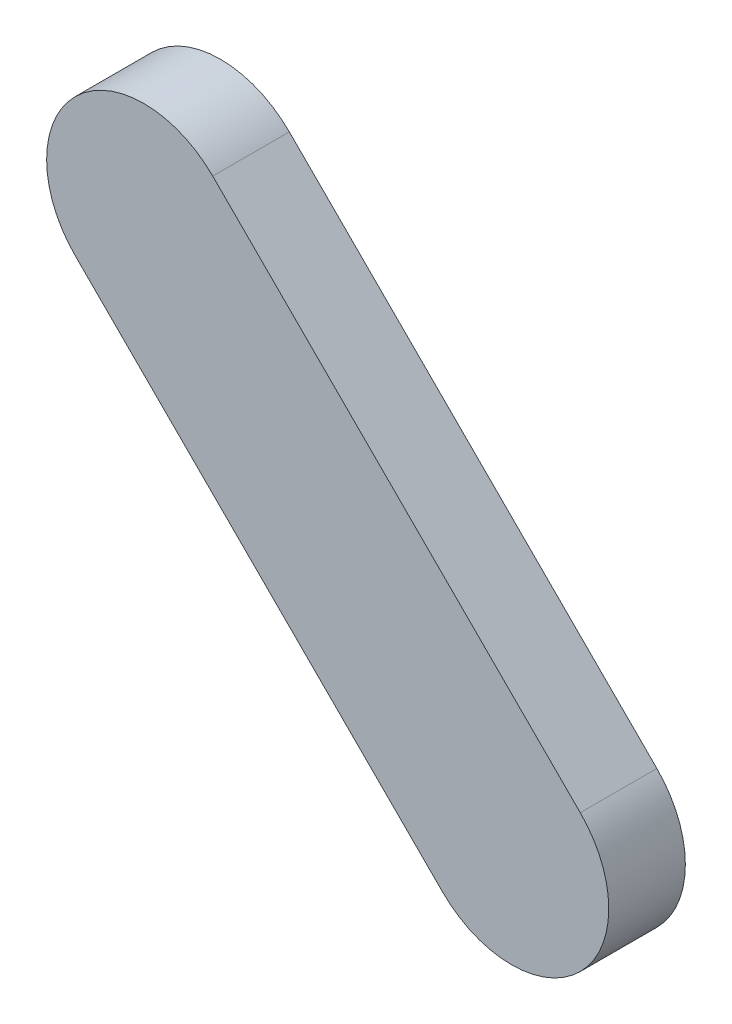
ISO-10303-21;
HEADER;
FILE_DESCRIPTION(('STEP AP214'),'2;1');
FILE_NAME('part.step','',(''),(''),'','','');
FILE_SCHEMA(('AUTOMOTIVE_DESIGN { 1 0 10303 214 1 1 1 1 }'));
ENDSEC;
DATA;
#1=APPLICATION_CONTEXT('core data for automotive mechanical design processes');
#2=APPLICATION_PROTOCOL_DEFINITION('international standard','automotive_design',2000,#1);
#3=PRODUCT_CONTEXT('',#1,'mechanical');
#4=PRODUCT('Part','Part','',(#3));
#5=PRODUCT_RELATED_PRODUCT_CATEGORY('part','',(#4));
#6=PRODUCT_DEFINITION_FORMATION('','',#4);
#7=PRODUCT_DEFINITION_CONTEXT('part definition',#1,'design');
#8=PRODUCT_DEFINITION('design','',#6,#7);
#9=PRODUCT_DEFINITION_SHAPE('','',#8);
#10=(LENGTH_UNIT() NAMED_UNIT(*) SI_UNIT(.MILLI.,.METRE.));
#11=(NAMED_UNIT(*) PLANE_ANGLE_UNIT() SI_UNIT($,.RADIAN.));
#12=(NAMED_UNIT(*) SI_UNIT($,.STERADIAN.) SOLID_ANGLE_UNIT());
#13=UNCERTAINTY_MEASURE_WITH_UNIT(LENGTH_MEASURE(1.E-05),#10,'distance_accuracy_value','');
#14=(GEOMETRIC_REPRESENTATION_CONTEXT(3) GLOBAL_UNCERTAINTY_ASSIGNED_CONTEXT((#13)) GLOBAL_UNIT_ASSIGNED_CONTEXT((#10,
#11,#12)) REPRESENTATION_CONTEXT('',''));
#15=CARTESIAN_POINT('',(0.,0.,0.));
#16=DIRECTION('',(0.,0.,1.));
#17=DIRECTION('',(1.,0.,0.));
#18=AXIS2_PLACEMENT_3D('',#15,#16,#17);
#19=CARTESIAN_POINT('',(149.93439406,76.2235966,0.));
#20=DIRECTION('',(0.707106781186553,0.707106781186542,0.));
#21=DIRECTION('',(0.707106781186542,-0.707106781186553,0.));
#22=AXIS2_PLACEMENT_3D('',#19,#20,#21);
#23=PLANE('',#22);
#24=DIRECTION('',(0.707106781186542,-0.707106781186553,0.));
#25=VECTOR('',#24,1.);
#26=CARTESIAN_POINT('',(149.93439406,76.2235966,0.1999996));
#27=LINE('',#26,#25);
#28=CARTESIAN_POINT('',(149.93439406,76.2235966,0.1999996));
#29=VERTEX_POINT('',#28);
#30=CARTESIAN_POINT('',(150.893907,75.26408366,0.1999996));
#31=VERTEX_POINT('',#30);
#32=EDGE_CURVE('E11',#29,#31,#27,.T.);
#33=ORIENTED_EDGE('',*,*,#32,.F.);
#34=DIRECTION('',(0.,0.,1.));
#35=VECTOR('',#34,1.);
#36=CARTESIAN_POINT('',(149.93439406,76.2235966,0.));
#37=LINE('',#36,#35);
#38=CARTESIAN_POINT('',(149.93439406,76.2235966,0.));
#39=VERTEX_POINT('',#38);
#40=EDGE_CURVE('E24',#39,#29,#37,.T.);
#41=ORIENTED_EDGE('',*,*,#40,.F.);
#42=DIRECTION('',(0.707106781186542,-0.707106781186553,0.));
#43=VECTOR('',#42,1.);
#44=CARTESIAN_POINT('',(149.93439406,76.2235966,0.));
#45=LINE('',#44,#43);
#46=CARTESIAN_POINT('',(150.893907,75.26408366,0.));
#47=VERTEX_POINT('',#46);
#48=EDGE_CURVE('E75',#39,#47,#45,.T.);
#49=ORIENTED_EDGE('',*,*,#48,.T.);
#50=DIRECTION('',(0.,0.,1.));
#51=VECTOR('',#50,1.);
#52=CARTESIAN_POINT('',(150.893907,75.26408366,0.));
#53=LINE('',#52,#51);
#54=EDGE_CURVE('E37',#47,#31,#53,.T.);
#55=ORIENTED_EDGE('',*,*,#54,.T.);
#56=EDGE_LOOP('',(#33,#41,#49,#55));
#57=FACE_BOUND('',#56,.T.);
#58=ADVANCED_FACE('F17',(#57),#23,.F.);
#59=CARTESIAN_POINT('',(151.07351167,75.44368833,0.));
#60=DIRECTION('',(0.,0.,-1.));
#61=DIRECTION('',(-0.707106781186576,-0.70710678118652,0.));
#62=AXIS2_PLACEMENT_3D('',#59,#60,#61);
#63=CYLINDRICAL_SURFACE('',#62,0.253999360179542);
#64=CARTESIAN_POINT('',(151.07351167,75.44368833,0.1999996));
#65=DIRECTION('',(0.,0.,1.));
#66=DIRECTION('',(-0.707106781186576,-0.70710678118652,0.));
#67=AXIS2_PLACEMENT_3D('',#64,#65,#66);
#68=CIRCLE('',#67,0.253999360179542);
#69=CARTESIAN_POINT('',(151.25311634,75.623293,0.1999996));
#70=VERTEX_POINT('',#69);
#71=EDGE_CURVE('E83',#31,#70,#68,.T.);
#72=ORIENTED_EDGE('',*,*,#71,.F.);
#73=ORIENTED_EDGE('',*,*,#54,.F.);
#74=CARTESIAN_POINT('',(151.07351167,75.44368833,0.));
#75=DIRECTION('',(0.,0.,1.));
#76=DIRECTION('',(-0.707106781186576,-0.70710678118652,0.));
#77=AXIS2_PLACEMENT_3D('',#74,#75,#76);
#78=CIRCLE('',#77,0.253999360179542);
#79=CARTESIAN_POINT('',(151.25311634,75.623293,0.));
#80=VERTEX_POINT('',#79);
#81=EDGE_CURVE('E81',#47,#80,#78,.T.);
#82=ORIENTED_EDGE('',*,*,#81,.T.);
#83=DIRECTION('',(0.,0.,1.));
#84=VECTOR('',#83,1.);
#85=CARTESIAN_POINT('',(151.25311634,75.623293,0.));
#86=LINE('',#85,#84);
#87=EDGE_CURVE('E67',#80,#70,#86,.T.);
#88=ORIENTED_EDGE('',*,*,#87,.T.);
#89=EDGE_LOOP('',(#72,#73,#82,#88));
#90=FACE_BOUND('',#89,.T.);
#91=ADVANCED_FACE('F89',(#90),#63,.T.);
#92=CARTESIAN_POINT('',(151.25311634,75.623293,0.));
#93=DIRECTION('',(-0.707106781186548,-0.707106781186548,0.));
#94=DIRECTION('',(-0.707106781186548,0.707106781186548,0.));
#95=AXIS2_PLACEMENT_3D('',#92,#93,#94);
#96=PLANE('',#95);
#97=DIRECTION('',(-0.707106781186548,0.707106781186548,0.));
#98=VECTOR('',#97,1.);
#99=CARTESIAN_POINT('',(151.25311634,75.623293,0.1999996));
#100=LINE('',#99,#98);
#101=CARTESIAN_POINT('',(150.2936034,76.58280594,0.1999996));
#102=VERTEX_POINT('',#101);
#103=EDGE_CURVE('E71',#70,#102,#100,.T.);
#104=ORIENTED_EDGE('',*,*,#103,.F.);
#105=ORIENTED_EDGE('',*,*,#87,.F.);
#106=DIRECTION('',(-0.707106781186548,0.707106781186548,0.));
#107=VECTOR('',#106,1.);
#108=CARTESIAN_POINT('',(151.25311634,75.623293,0.));
#109=LINE('',#108,#107);
#110=CARTESIAN_POINT('',(150.2936034,76.58280594,0.));
#111=VERTEX_POINT('',#110);
#112=EDGE_CURVE('E63',#80,#111,#109,.T.);
#113=ORIENTED_EDGE('',*,*,#112,.T.);
#114=DIRECTION('',(0.,0.,1.));
#115=VECTOR('',#114,1.);
#116=CARTESIAN_POINT('',(150.2936034,76.58280594,0.));
#117=LINE('',#116,#115);
#118=EDGE_CURVE('E53',#111,#102,#117,.T.);
#119=ORIENTED_EDGE('',*,*,#118,.T.);
#120=EDGE_LOOP('',(#104,#105,#113,#119));
#121=FACE_BOUND('',#120,.T.);
#122=ADVANCED_FACE('F66',(#121),#96,.F.);
#123=CARTESIAN_POINT('',(150.11399873,76.40320127,0.));
#124=DIRECTION('',(0.,0.,-1.));
#125=DIRECTION('',(0.707106781186576,0.70710678118652,0.));
#126=AXIS2_PLACEMENT_3D('',#123,#124,#125);
#127=CYLINDRICAL_SURFACE('',#126,0.253999360179539);
#128=CARTESIAN_POINT('',(150.11399873,76.40320127,0.1999996));
#129=DIRECTION('',(0.,0.,1.));
#130=DIRECTION('',(0.707106781186576,0.70710678118652,0.));
#131=AXIS2_PLACEMENT_3D('',#128,#129,#130);
#132=CIRCLE('',#131,0.253999360179539);
#133=EDGE_CURVE('E59',#102,#29,#132,.T.);
#134=ORIENTED_EDGE('',*,*,#133,.F.);
#135=ORIENTED_EDGE('',*,*,#118,.F.);
#136=CARTESIAN_POINT('',(150.11399873,76.40320127,0.));
#137=DIRECTION('',(0.,0.,1.));
#138=DIRECTION('',(0.707106781186576,0.70710678118652,0.));
#139=AXIS2_PLACEMENT_3D('',#136,#137,#138);
#140=CIRCLE('',#139,0.253999360179539);
#141=EDGE_CURVE('E57',#111,#39,#140,.T.);
#142=ORIENTED_EDGE('',*,*,#141,.T.);
#143=ORIENTED_EDGE('',*,*,#40,.T.);
#144=EDGE_LOOP('',(#134,#135,#142,#143));
#145=FACE_BOUND('',#144,.T.);
#146=ADVANCED_FACE('F55',(#145),#127,.T.);
#147=CARTESIAN_POINT('',(149.93439406,76.2235966,0.));
#148=DIRECTION('',(0.,0.,-1.));
#149=DIRECTION('',(-1.,0.,0.));
#150=AXIS2_PLACEMENT_3D('',#147,#148,#149);
#151=PLANE('',#150);
#152=ORIENTED_EDGE('',*,*,#141,.F.);
#153=ORIENTED_EDGE('',*,*,#112,.F.);
#154=ORIENTED_EDGE('',*,*,#81,.F.);
#155=ORIENTED_EDGE('',*,*,#48,.F.);
#156=EDGE_LOOP('',(#152,#153,#154,#155));
#157=FACE_BOUND('',#156,.T.);
#158=ADVANCED_FACE('F74',(#157),#151,.T.);
#159=CARTESIAN_POINT('',(149.93439406,76.2235966,0.1999996));
#160=DIRECTION('',(0.,0.,-1.));
#161=DIRECTION('',(-1.,0.,0.));
#162=AXIS2_PLACEMENT_3D('',#159,#160,#161);
#163=PLANE('',#162);
#164=ORIENTED_EDGE('',*,*,#32,.T.);
#165=ORIENTED_EDGE('',*,*,#71,.T.);
#166=ORIENTED_EDGE('',*,*,#103,.T.);
#167=ORIENTED_EDGE('',*,*,#133,.T.);
#168=EDGE_LOOP('',(#164,#165,#166,#167));
#169=FACE_BOUND('',#168,.T.);
#170=ADVANCED_FACE('F91',(#169),#163,.F.);
#171=CLOSED_SHELL('',(#58,#91,#122,#146,#158,#170));
#172=MANIFOLD_SOLID_BREP('B1',#171);
#173=ADVANCED_BREP_SHAPE_REPRESENTATION('',(#18,#172),#14);
#174=SHAPE_DEFINITION_REPRESENTATION(#9,#173);
ENDSEC;
END-ISO-10303-21;
